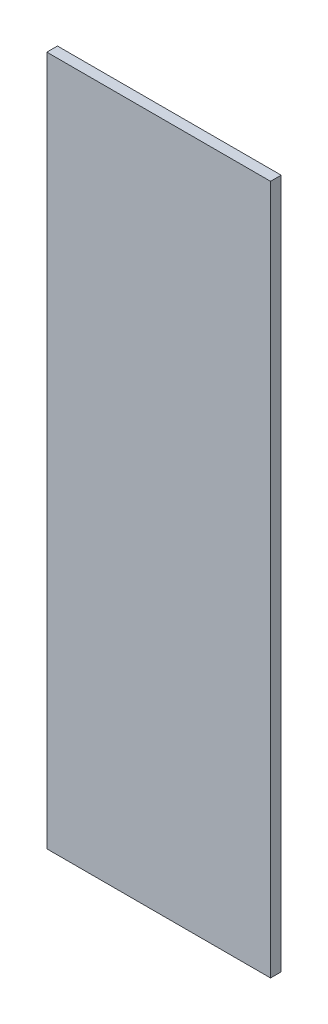
ISO-10303-21;
HEADER;
FILE_DESCRIPTION(('STEP AP214'),'2;1');
FILE_NAME('part.step','',(''),(''),'','','');
FILE_SCHEMA(('AUTOMOTIVE_DESIGN { 1 0 10303 214 1 1 1 1 }'));
ENDSEC;
DATA;
#1=APPLICATION_CONTEXT('core data for automotive mechanical design processes');
#2=APPLICATION_PROTOCOL_DEFINITION('international standard','automotive_design',2000,#1);
#3=PRODUCT_CONTEXT('',#1,'mechanical');
#4=PRODUCT('Part','Part','',(#3));
#5=PRODUCT_RELATED_PRODUCT_CATEGORY('part','',(#4));
#6=PRODUCT_DEFINITION_FORMATION('','',#4);
#7=PRODUCT_DEFINITION_CONTEXT('part definition',#1,'design');
#8=PRODUCT_DEFINITION('design','',#6,#7);
#9=PRODUCT_DEFINITION_SHAPE('','',#8);
#10=(LENGTH_UNIT() NAMED_UNIT(*) SI_UNIT(.MILLI.,.METRE.));
#11=(NAMED_UNIT(*) PLANE_ANGLE_UNIT() SI_UNIT($,.RADIAN.));
#12=(NAMED_UNIT(*) SI_UNIT($,.STERADIAN.) SOLID_ANGLE_UNIT());
#13=UNCERTAINTY_MEASURE_WITH_UNIT(LENGTH_MEASURE(1.E-05),#10,'distance_accuracy_value','');
#14=(GEOMETRIC_REPRESENTATION_CONTEXT(3) GLOBAL_UNCERTAINTY_ASSIGNED_CONTEXT((#13)) GLOBAL_UNIT_ASSIGNED_CONTEXT((#10,
#11,#12)) REPRESENTATION_CONTEXT('',''));
#15=CARTESIAN_POINT('',(0.,0.,0.));
#16=DIRECTION('',(0.,0.,1.));
#17=DIRECTION('',(1.,0.,0.));
#18=AXIS2_PLACEMENT_3D('',#15,#16,#17);
#19=CARTESIAN_POINT('',(267.500000051,-825.,25.4));
#20=DIRECTION('',(-1.,0.,0.));
#21=DIRECTION('',(0.,0.,1.));
#22=AXIS2_PLACEMENT_3D('',#19,#20,#21);
#23=PLANE('',#22);
#24=DIRECTION('',(0.,1.,0.));
#25=VECTOR('',#24,1.);
#26=CARTESIAN_POINT('',(267.500000051,-825.,0.));
#27=LINE('',#26,#25);
#28=CARTESIAN_POINT('',(267.500000051,-825.,0.));
#29=VERTEX_POINT('',#28);
#30=CARTESIAN_POINT('',(267.500000051,825.,0.));
#31=VERTEX_POINT('',#30);
#32=EDGE_CURVE('E102',#29,#31,#27,.T.);
#33=ORIENTED_EDGE('',*,*,#32,.T.);
#34=DIRECTION('',(0.,0.,-1.));
#35=VECTOR('',#34,1.);
#36=CARTESIAN_POINT('',(267.500000051,825.,25.4));
#37=LINE('',#36,#35);
#38=CARTESIAN_POINT('',(267.500000051,825.,25.4));
#39=VERTEX_POINT('',#38);
#40=EDGE_CURVE('E11',#39,#31,#37,.T.);
#41=ORIENTED_EDGE('',*,*,#40,.F.);
#42=DIRECTION('',(0.,1.,0.));
#43=VECTOR('',#42,1.);
#44=CARTESIAN_POINT('',(267.500000051,-825.,25.4));
#45=LINE('',#44,#43);
#46=CARTESIAN_POINT('',(267.500000051,-825.,25.4));
#47=VERTEX_POINT('',#46);
#48=EDGE_CURVE('E90',#47,#39,#45,.T.);
#49=ORIENTED_EDGE('',*,*,#48,.F.);
#50=DIRECTION('',(0.,0.,-1.));
#51=VECTOR('',#50,1.);
#52=CARTESIAN_POINT('',(267.500000051,-825.,25.4));
#53=LINE('',#52,#51);
#54=EDGE_CURVE('E98',#47,#29,#53,.T.);
#55=ORIENTED_EDGE('',*,*,#54,.T.);
#56=EDGE_LOOP('',(#33,#41,#49,#55));
#57=FACE_BOUND('',#56,.T.);
#58=ADVANCED_FACE('F39',(#57),#23,.F.);
#59=CARTESIAN_POINT('',(-267.500000051,825.,25.4));
#60=DIRECTION('',(0.,-1.,0.));
#61=DIRECTION('',(0.,0.,-1.));
#62=AXIS2_PLACEMENT_3D('',#59,#60,#61);
#63=PLANE('',#62);
#64=DIRECTION('',(-1.,0.,0.));
#65=VECTOR('',#64,1.);
#66=CARTESIAN_POINT('',(-267.500000051,825.,0.));
#67=LINE('',#66,#65);
#68=CARTESIAN_POINT('',(-267.500000051,825.,0.));
#69=VERTEX_POINT('',#68);
#70=EDGE_CURVE('E94',#31,#69,#67,.T.);
#71=ORIENTED_EDGE('',*,*,#70,.T.);
#72=DIRECTION('',(0.,0.,-1.));
#73=VECTOR('',#72,1.);
#74=CARTESIAN_POINT('',(-267.500000051,825.,25.4));
#75=LINE('',#74,#73);
#76=CARTESIAN_POINT('',(-267.500000051,825.,25.4));
#77=VERTEX_POINT('',#76);
#78=EDGE_CURVE('E47',#77,#69,#75,.T.);
#79=ORIENTED_EDGE('',*,*,#78,.F.);
#80=DIRECTION('',(-1.,0.,0.));
#81=VECTOR('',#80,1.);
#82=CARTESIAN_POINT('',(-267.500000051,825.,25.4));
#83=LINE('',#82,#81);
#84=EDGE_CURVE('E85',#39,#77,#83,.T.);
#85=ORIENTED_EDGE('',*,*,#84,.F.);
#86=ORIENTED_EDGE('',*,*,#40,.T.);
#87=EDGE_LOOP('',(#71,#79,#85,#86));
#88=FACE_BOUND('',#87,.T.);
#89=ADVANCED_FACE('F93',(#88),#63,.F.);
#90=CARTESIAN_POINT('',(-267.500000051,-825.,25.4));
#91=DIRECTION('',(1.,0.,0.));
#92=DIRECTION('',(0.,0.,-1.));
#93=AXIS2_PLACEMENT_3D('',#90,#91,#92);
#94=PLANE('',#93);
#95=DIRECTION('',(0.,-1.,0.));
#96=VECTOR('',#95,1.);
#97=CARTESIAN_POINT('',(-267.500000051,-825.,0.));
#98=LINE('',#97,#96);
#99=CARTESIAN_POINT('',(-267.500000051,-825.,0.));
#100=VERTEX_POINT('',#99);
#101=EDGE_CURVE('E72',#69,#100,#98,.T.);
#102=ORIENTED_EDGE('',*,*,#101,.T.);
#103=DIRECTION('',(0.,0.,-1.));
#104=VECTOR('',#103,1.);
#105=CARTESIAN_POINT('',(-267.500000051,-825.,25.4));
#106=LINE('',#105,#104);
#107=CARTESIAN_POINT('',(-267.500000051,-825.,25.4));
#108=VERTEX_POINT('',#107);
#109=EDGE_CURVE('E95',#108,#100,#106,.T.);
#110=ORIENTED_EDGE('',*,*,#109,.F.);
#111=DIRECTION('',(0.,-1.,0.));
#112=VECTOR('',#111,1.);
#113=CARTESIAN_POINT('',(-267.500000051,-825.,25.4));
#114=LINE('',#113,#112);
#115=EDGE_CURVE('E88',#77,#108,#114,.T.);
#116=ORIENTED_EDGE('',*,*,#115,.F.);
#117=ORIENTED_EDGE('',*,*,#78,.T.);
#118=EDGE_LOOP('',(#102,#110,#116,#117));
#119=FACE_BOUND('',#118,.T.);
#120=ADVANCED_FACE('F96',(#119),#94,.F.);
#121=CARTESIAN_POINT('',(-267.500000051,-825.,25.4));
#122=DIRECTION('',(0.,1.,0.));
#123=DIRECTION('',(0.,0.,1.));
#124=AXIS2_PLACEMENT_3D('',#121,#122,#123);
#125=PLANE('',#124);
#126=DIRECTION('',(1.,0.,0.));
#127=VECTOR('',#126,1.);
#128=CARTESIAN_POINT('',(-267.500000051,-825.,0.));
#129=LINE('',#128,#127);
#130=EDGE_CURVE('E78',#100,#29,#129,.T.);
#131=ORIENTED_EDGE('',*,*,#130,.T.);
#132=ORIENTED_EDGE('',*,*,#54,.F.);
#133=DIRECTION('',(1.,0.,0.));
#134=VECTOR('',#133,1.);
#135=CARTESIAN_POINT('',(-267.500000051,-825.,25.4));
#136=LINE('',#135,#134);
#137=EDGE_CURVE('E55',#108,#47,#136,.T.);
#138=ORIENTED_EDGE('',*,*,#137,.F.);
#139=ORIENTED_EDGE('',*,*,#109,.T.);
#140=EDGE_LOOP('',(#131,#132,#138,#139));
#141=FACE_BOUND('',#140,.T.);
#142=ADVANCED_FACE('F109',(#141),#125,.F.);
#143=CARTESIAN_POINT('',(0.,0.,25.4));
#144=DIRECTION('',(0.,0.,-1.));
#145=DIRECTION('',(-1.,0.,0.));
#146=AXIS2_PLACEMENT_3D('',#143,#144,#145);
#147=PLANE('',#146);
#148=ORIENTED_EDGE('',*,*,#48,.T.);
#149=ORIENTED_EDGE('',*,*,#84,.T.);
#150=ORIENTED_EDGE('',*,*,#115,.T.);
#151=ORIENTED_EDGE('',*,*,#137,.T.);
#152=EDGE_LOOP('',(#148,#149,#150,#151));
#153=FACE_BOUND('',#152,.T.);
#154=ADVANCED_FACE('F86',(#153),#147,.F.);
#155=CARTESIAN_POINT('',(0.,0.,0.));
#156=DIRECTION('',(0.,0.,-1.));
#157=DIRECTION('',(-1.,0.,0.));
#158=AXIS2_PLACEMENT_3D('',#155,#156,#157);
#159=PLANE('',#158);
#160=ORIENTED_EDGE('',*,*,#32,.F.);
#161=ORIENTED_EDGE('',*,*,#130,.F.);
#162=ORIENTED_EDGE('',*,*,#101,.F.);
#163=ORIENTED_EDGE('',*,*,#70,.F.);
#164=EDGE_LOOP('',(#160,#161,#162,#163));
#165=FACE_BOUND('',#164,.T.);
#166=ADVANCED_FACE('F112',(#165),#159,.T.);
#167=CLOSED_SHELL('',(#58,#89,#120,#142,#154,#166));
#168=MANIFOLD_SOLID_BREP('B2',#167);
#169=ADVANCED_BREP_SHAPE_REPRESENTATION('',(#18,#168),#14);
#170=SHAPE_DEFINITION_REPRESENTATION(#9,#169);
ENDSEC;
END-ISO-10303-21;
